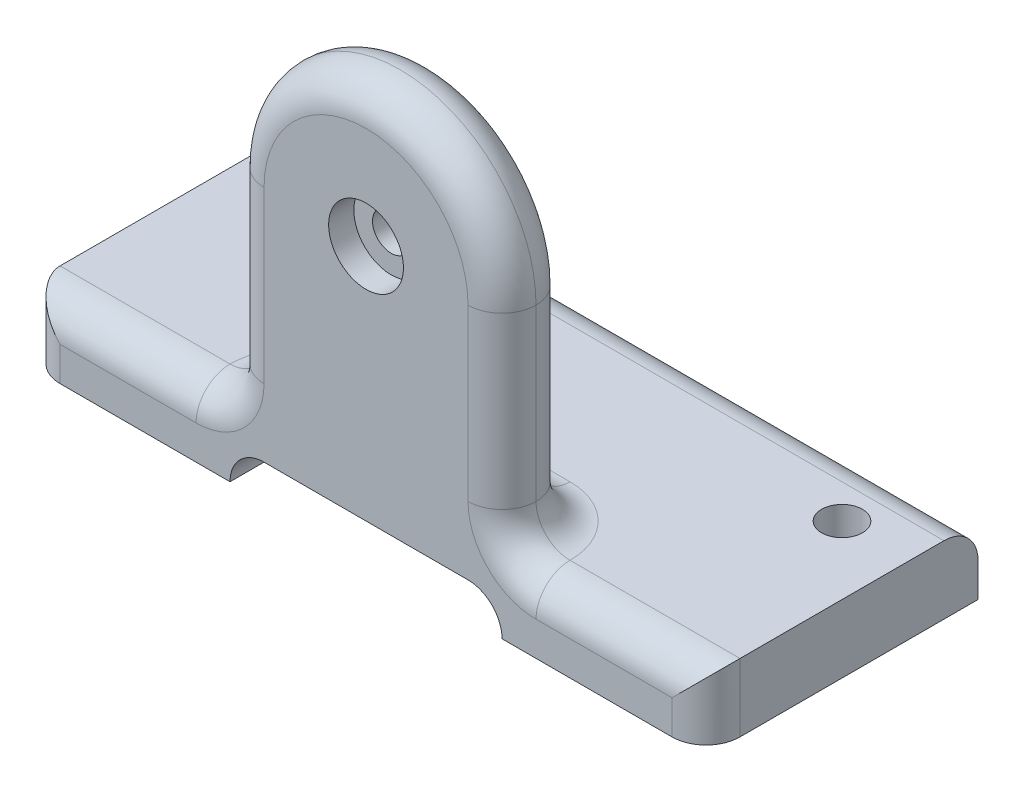
ISO-10303-21;
HEADER;
FILE_DESCRIPTION(('STEP AP214'),'2;1');
FILE_NAME('part.step','',(''),(''),'','','');
FILE_SCHEMA(('AUTOMOTIVE_DESIGN { 1 0 10303 214 1 1 1 1 }'));
ENDSEC;
DATA;
#1=APPLICATION_CONTEXT('core data for automotive mechanical design processes');
#2=APPLICATION_PROTOCOL_DEFINITION('international standard','automotive_design',2000,#1);
#3=PRODUCT_CONTEXT('',#1,'mechanical');
#4=PRODUCT('Part','Part','',(#3));
#5=PRODUCT_RELATED_PRODUCT_CATEGORY('part','',(#4));
#6=PRODUCT_DEFINITION_FORMATION('','',#4);
#7=PRODUCT_DEFINITION_CONTEXT('part definition',#1,'design');
#8=PRODUCT_DEFINITION('design','',#6,#7);
#9=PRODUCT_DEFINITION_SHAPE('','',#8);
#10=(LENGTH_UNIT() NAMED_UNIT(*) SI_UNIT(.MILLI.,.METRE.));
#11=(NAMED_UNIT(*) PLANE_ANGLE_UNIT() SI_UNIT($,.RADIAN.));
#12=(NAMED_UNIT(*) SI_UNIT($,.STERADIAN.) SOLID_ANGLE_UNIT());
#13=UNCERTAINTY_MEASURE_WITH_UNIT(LENGTH_MEASURE(1.E-05),#10,'distance_accuracy_value','');
#14=(GEOMETRIC_REPRESENTATION_CONTEXT(3) GLOBAL_UNCERTAINTY_ASSIGNED_CONTEXT((#13)) GLOBAL_UNIT_ASSIGNED_CONTEXT((#10,
#11,#12)) REPRESENTATION_CONTEXT('',''));
#15=CARTESIAN_POINT('',(0.,0.,0.));
#16=DIRECTION('',(0.,0.,1.));
#17=DIRECTION('',(1.,0.,0.));
#18=AXIS2_PLACEMENT_3D('',#15,#16,#17);
#19=CARTESIAN_POINT('',(-50.,10.,-20.));
#20=DIRECTION('',(0.,0.,1.));
#21=DIRECTION('',(1.,0.,0.));
#22=AXIS2_PLACEMENT_3D('',#19,#20,#21);
#23=PLANE('',#22);
#24=DIRECTION('',(0.,-1.,0.));
#25=VECTOR('',#24,1.);
#26=CARTESIAN_POINT('',(-50.,10.,-20.));
#27=LINE('',#26,#25);
#28=CARTESIAN_POINT('',(-50.,5.,-20.));
#29=VERTEX_POINT('',#28);
#30=CARTESIAN_POINT('',(-50.,0.,-20.));
#31=VERTEX_POINT('',#30);
#32=EDGE_CURVE('E192',#29,#31,#27,.T.);
#33=ORIENTED_EDGE('',*,*,#32,.F.);
#34=DIRECTION('',(-1.,0.,0.));
#35=VECTOR('',#34,1.);
#36=CARTESIAN_POINT('',(50.,5.,-20.));
#37=LINE('',#36,#35);
#38=CARTESIAN_POINT('',(-15.,5.,-20.));
#39=VERTEX_POINT('',#38);
#40=EDGE_CURVE('E11',#29,#39,#37,.F.);
#41=ORIENTED_EDGE('',*,*,#40,.T.);
#42=CARTESIAN_POINT('',(-15.,0.,-20.));
#43=DIRECTION('',(0.,0.,1.));
#44=DIRECTION('',(1.,0.,0.));
#45=AXIS2_PLACEMENT_3D('',#42,#43,#44);
#46=CIRCLE('',#45,5.);
#47=CARTESIAN_POINT('',(-20.,0.,-20.));
#48=VERTEX_POINT('',#47);
#49=EDGE_CURVE('E190',#39,#48,#46,.T.);
#50=ORIENTED_EDGE('',*,*,#49,.T.);
#51=DIRECTION('',(-1.,0.,0.));
#52=VECTOR('',#51,1.);
#53=CARTESIAN_POINT('',(-50.,0.,-20.));
#54=LINE('',#53,#52);
#55=EDGE_CURVE('E309',#48,#31,#54,.T.);
#56=ORIENTED_EDGE('',*,*,#55,.T.);
#57=EDGE_LOOP('',(#33,#41,#50,#56));
#58=FACE_BOUND('',#57,.T.);
#59=ADVANCED_FACE('F35',(#58),#23,.F.);
#60=CARTESIAN_POINT('',(0.,0.,0.));
#61=DIRECTION('',(0.,1.,0.));
#62=DIRECTION('',(0.,0.,1.));
#63=AXIS2_PLACEMENT_3D('',#60,#61,#62);
#64=PLANE('',#63);
#65=CARTESIAN_POINT('',(-40.,0.,-9.99999999999999));
#66=DIRECTION('',(0.,1.,0.));
#67=DIRECTION('',(0.,0.,1.));
#68=AXIS2_PLACEMENT_3D('',#65,#66,#67);
#69=CIRCLE('',#68,3.);
#70=CARTESIAN_POINT('',(-40.,0.,-6.99999999999999));
#71=VERTEX_POINT('',#70);
#72=EDGE_CURVE('E295',#71,#71,#69,.T.);
#73=ORIENTED_EDGE('',*,*,#72,.T.);
#74=EDGE_LOOP('',(#73));
#75=FACE_BOUND('',#74,.T.);
#76=DIRECTION('',(1.,0.,0.));
#77=VECTOR('',#76,1.);
#78=CARTESIAN_POINT('',(-50.,0.,20.));
#79=LINE('',#78,#77);
#80=CARTESIAN_POINT('',(-45.,0.,20.));
#81=VERTEX_POINT('',#80);
#82=CARTESIAN_POINT('',(-20.,0.,20.));
#83=VERTEX_POINT('',#82);
#84=EDGE_CURVE('E305',#81,#83,#79,.T.);
#85=ORIENTED_EDGE('',*,*,#84,.F.);
#86=CARTESIAN_POINT('',(-45.,0.,15.));
#87=DIRECTION('',(0.,1.,0.));
#88=DIRECTION('',(0.,0.,1.));
#89=AXIS2_PLACEMENT_3D('',#86,#87,#88);
#90=CIRCLE('',#89,5.);
#91=CARTESIAN_POINT('',(-50.,0.,15.));
#92=VERTEX_POINT('',#91);
#93=EDGE_CURVE('E206',#81,#92,#90,.F.);
#94=ORIENTED_EDGE('',*,*,#93,.T.);
#95=DIRECTION('',(0.,0.,1.));
#96=VECTOR('',#95,1.);
#97=CARTESIAN_POINT('',(-50.,0.,-20.));
#98=LINE('',#97,#96);
#99=EDGE_CURVE('E313',#31,#92,#98,.T.);
#100=ORIENTED_EDGE('',*,*,#99,.F.);
#101=ORIENTED_EDGE('',*,*,#55,.F.);
#102=DIRECTION('',(0.,0.,1.));
#103=VECTOR('',#102,1.);
#104=CARTESIAN_POINT('',(-20.,0.,-20.));
#105=LINE('',#104,#103);
#106=EDGE_CURVE('E211',#48,#83,#105,.T.);
#107=ORIENTED_EDGE('',*,*,#106,.T.);
#108=EDGE_LOOP('',(#85,#94,#100,#101,#107));
#109=FACE_BOUND('',#108,.T.);
#110=ADVANCED_FACE('F393',(#75,#109),#64,.F.);
#111=CARTESIAN_POINT('',(50.,10.,-20.));
#112=DIRECTION('',(-1.,0.,0.));
#113=DIRECTION('',(0.,0.,1.));
#114=AXIS2_PLACEMENT_3D('',#111,#112,#113);
#115=PLANE('',#114);
#116=DIRECTION('',(0.,-1.,0.));
#117=VECTOR('',#116,1.);
#118=CARTESIAN_POINT('',(50.,10.,-20.));
#119=LINE('',#118,#117);
#120=CARTESIAN_POINT('',(50.,5.,-20.));
#121=VERTEX_POINT('',#120);
#122=CARTESIAN_POINT('',(50.,0.,-20.));
#123=VERTEX_POINT('',#122);
#124=EDGE_CURVE('E319',#121,#123,#119,.T.);
#125=ORIENTED_EDGE('',*,*,#124,.F.);
#126=CARTESIAN_POINT('',(50.,5.,-15.));
#127=DIRECTION('',(-1.,0.,0.));
#128=DIRECTION('',(0.,0.,1.));
#129=AXIS2_PLACEMENT_3D('',#126,#127,#128);
#130=CIRCLE('',#129,5.);
#131=CARTESIAN_POINT('',(50.,10.,-15.));
#132=VERTEX_POINT('',#131);
#133=EDGE_CURVE('E371',#121,#132,#130,.F.);
#134=ORIENTED_EDGE('',*,*,#133,.T.);
#135=DIRECTION('',(0.,0.,-1.));
#136=VECTOR('',#135,1.);
#137=CARTESIAN_POINT('',(50.,10.,-20.));
#138=LINE('',#137,#136);
#139=CARTESIAN_POINT('',(50.,10.,15.));
#140=VERTEX_POINT('',#139);
#141=EDGE_CURVE('E301',#140,#132,#138,.T.);
#142=ORIENTED_EDGE('',*,*,#141,.F.);
#143=DIRECTION('',(0.,-1.,0.));
#144=VECTOR('',#143,1.);
#145=CARTESIAN_POINT('',(50.,10.,15.));
#146=LINE('',#145,#144);
#147=CARTESIAN_POINT('',(50.,0.,15.));
#148=VERTEX_POINT('',#147);
#149=EDGE_CURVE('E54',#140,#148,#146,.T.);
#150=ORIENTED_EDGE('',*,*,#149,.T.);
#151=DIRECTION('',(0.,0.,-1.));
#152=VECTOR('',#151,1.);
#153=CARTESIAN_POINT('',(50.,0.,-20.));
#154=LINE('',#153,#152);
#155=EDGE_CURVE('E298',#148,#123,#154,.T.);
#156=ORIENTED_EDGE('',*,*,#155,.T.);
#157=EDGE_LOOP('',(#125,#134,#142,#150,#156));
#158=FACE_BOUND('',#157,.T.);
#159=ADVANCED_FACE('F411',(#158),#115,.F.);
#160=CARTESIAN_POINT('',(15.,0.,-20.));
#161=DIRECTION('',(0.,0.,1.));
#162=DIRECTION('',(1.,0.,0.));
#163=AXIS2_PLACEMENT_3D('',#160,#161,#162);
#164=CIRCLE('',#163,5.);
#165=CARTESIAN_POINT('',(20.,0.,-20.));
#166=VERTEX_POINT('',#165);
#167=CARTESIAN_POINT('',(15.,5.,-20.));
#168=VERTEX_POINT('',#167);
#169=EDGE_CURVE('E216',#166,#168,#164,.T.);
#170=ORIENTED_EDGE('',*,*,#169,.T.);
#171=DIRECTION('',(-1.,0.,0.));
#172=VECTOR('',#171,1.);
#173=CARTESIAN_POINT('',(50.,5.,-20.));
#174=LINE('',#173,#172);
#175=EDGE_CURVE('E45',#168,#121,#174,.F.);
#176=ORIENTED_EDGE('',*,*,#175,.T.);
#177=ORIENTED_EDGE('',*,*,#124,.T.);
#178=EDGE_CURVE('E310',#123,#166,#54,.T.);
#179=ORIENTED_EDGE('',*,*,#178,.T.);
#180=EDGE_LOOP('',(#170,#176,#177,#179));
#181=FACE_BOUND('',#180,.T.);
#182=ADVANCED_FACE('F380',(#181),#23,.F.);
#183=CARTESIAN_POINT('',(-50.,10.,-20.));
#184=DIRECTION('',(1.,0.,0.));
#185=DIRECTION('',(0.,0.,-1.));
#186=AXIS2_PLACEMENT_3D('',#183,#184,#185);
#187=PLANE('',#186);
#188=DIRECTION('',(0.,0.,1.));
#189=VECTOR('',#188,1.);
#190=CARTESIAN_POINT('',(-50.,10.,-20.));
#191=LINE('',#190,#189);
#192=CARTESIAN_POINT('',(-50.,10.,-15.));
#193=VERTEX_POINT('',#192);
#194=CARTESIAN_POINT('',(-50.,10.,15.));
#195=VERTEX_POINT('',#194);
#196=EDGE_CURVE('E304',#193,#195,#191,.T.);
#197=ORIENTED_EDGE('',*,*,#196,.F.);
#198=CARTESIAN_POINT('',(-50.,5.,-15.));
#199=DIRECTION('',(1.,0.,0.));
#200=DIRECTION('',(0.,0.,-1.));
#201=AXIS2_PLACEMENT_3D('',#198,#199,#200);
#202=CIRCLE('',#201,5.);
#203=EDGE_CURVE('E368',#193,#29,#202,.F.);
#204=ORIENTED_EDGE('',*,*,#203,.T.);
#205=ORIENTED_EDGE('',*,*,#32,.T.);
#206=ORIENTED_EDGE('',*,*,#99,.T.);
#207=DIRECTION('',(0.,-1.,0.));
#208=VECTOR('',#207,1.);
#209=CARTESIAN_POINT('',(-50.,10.,15.));
#210=LINE('',#209,#208);
#211=EDGE_CURVE('E366',#92,#195,#210,.F.);
#212=ORIENTED_EDGE('',*,*,#211,.T.);
#213=EDGE_LOOP('',(#197,#204,#205,#206,#212));
#214=FACE_BOUND('',#213,.T.);
#215=ADVANCED_FACE('F398',(#214),#187,.F.);
#216=CARTESIAN_POINT('',(-50.,10.,20.));
#217=DIRECTION('',(0.,0.,-1.));
#218=DIRECTION('',(-1.,0.,0.));
#219=AXIS2_PLACEMENT_3D('',#216,#217,#218);
#220=PLANE('',#219);
#221=CARTESIAN_POINT('',(0.,40.,20.));
#222=DIRECTION('',(0.,0.,1.));
#223=DIRECTION('',(1.,0.,0.));
#224=AXIS2_PLACEMENT_3D('',#221,#222,#223);
#225=CIRCLE('',#224,5.5);
#226=CARTESIAN_POINT('',(5.50000000000002,40.,20.));
#227=VERTEX_POINT('',#226);
#228=EDGE_CURVE('E275',#227,#227,#225,.T.);
#229=ORIENTED_EDGE('',*,*,#228,.F.);
#230=EDGE_LOOP('',(#229));
#231=FACE_BOUND('',#230,.T.);
#232=CARTESIAN_POINT('',(20.,0.,20.));
#233=VERTEX_POINT('',#232);
#234=CARTESIAN_POINT('',(45.,0.,20.));
#235=VERTEX_POINT('',#234);
#236=EDGE_CURVE('E316',#233,#235,#79,.T.);
#237=ORIENTED_EDGE('',*,*,#236,.T.);
#238=DIRECTION('',(0.,-1.,0.));
#239=VECTOR('',#238,1.);
#240=CARTESIAN_POINT('',(45.,10.,20.));
#241=LINE('',#240,#239);
#242=CARTESIAN_POINT('',(45.,5.,20.));
#243=VERTEX_POINT('',#242);
#244=EDGE_CURVE('E355',#235,#243,#241,.F.);
#245=ORIENTED_EDGE('',*,*,#244,.T.);
#246=DIRECTION('',(1.,0.,0.));
#247=VECTOR('',#246,1.);
#248=CARTESIAN_POINT('',(20.,5.,20.));
#249=LINE('',#248,#247);
#250=CARTESIAN_POINT('',(25.,5.,20.));
#251=VERTEX_POINT('',#250);
#252=EDGE_CURVE('E353',#243,#251,#249,.F.);
#253=ORIENTED_EDGE('',*,*,#252,.T.);
#254=CARTESIAN_POINT('',(25.,15.,20.));
#255=DIRECTION('',(0.,0.,-1.));
#256=DIRECTION('',(-1.,0.,0.));
#257=AXIS2_PLACEMENT_3D('',#254,#255,#256);
#258=CIRCLE('',#257,10.);
#259=CARTESIAN_POINT('',(15.,15.,20.));
#260=VERTEX_POINT('',#259);
#261=EDGE_CURVE('E350',#260,#251,#258,.F.);
#262=ORIENTED_EDGE('',*,*,#261,.F.);
#263=DIRECTION('',(0.,1.,0.));
#264=VECTOR('',#263,1.);
#265=CARTESIAN_POINT('',(15.,40.,20.));
#266=LINE('',#265,#264);
#267=CARTESIAN_POINT('',(15.,40.,20.));
#268=VERTEX_POINT('',#267);
#269=EDGE_CURVE('E348',#260,#268,#266,.T.);
#270=ORIENTED_EDGE('',*,*,#269,.T.);
#271=CARTESIAN_POINT('',(0.,40.,20.));
#272=DIRECTION('',(0.,0.,-1.));
#273=DIRECTION('',(-1.,0.,0.));
#274=AXIS2_PLACEMENT_3D('',#271,#272,#273);
#275=CIRCLE('',#274,15.);
#276=CARTESIAN_POINT('',(-15.,40.,20.));
#277=VERTEX_POINT('',#276);
#278=EDGE_CURVE('E346',#268,#277,#275,.F.);
#279=ORIENTED_EDGE('',*,*,#278,.T.);
#280=DIRECTION('',(0.,-1.,0.));
#281=VECTOR('',#280,1.);
#282=CARTESIAN_POINT('',(-15.,10.,20.));
#283=LINE('',#282,#281);
#284=CARTESIAN_POINT('',(-15.,15.,20.));
#285=VERTEX_POINT('',#284);
#286=EDGE_CURVE('E344',#277,#285,#283,.T.);
#287=ORIENTED_EDGE('',*,*,#286,.T.);
#288=CARTESIAN_POINT('',(-25.,15.,20.));
#289=DIRECTION('',(0.,0.,-1.));
#290=DIRECTION('',(-1.,0.,0.));
#291=AXIS2_PLACEMENT_3D('',#288,#289,#290);
#292=CIRCLE('',#291,10.);
#293=CARTESIAN_POINT('',(-25.,5.,20.));
#294=VERTEX_POINT('',#293);
#295=EDGE_CURVE('E341',#294,#285,#292,.F.);
#296=ORIENTED_EDGE('',*,*,#295,.F.);
#297=DIRECTION('',(1.,0.,0.));
#298=VECTOR('',#297,1.);
#299=CARTESIAN_POINT('',(-50.,5.,20.));
#300=LINE('',#299,#298);
#301=CARTESIAN_POINT('',(-45.,5.,20.));
#302=VERTEX_POINT('',#301);
#303=EDGE_CURVE('E339',#294,#302,#300,.F.);
#304=ORIENTED_EDGE('',*,*,#303,.T.);
#305=DIRECTION('',(0.,-1.,0.));
#306=VECTOR('',#305,1.);
#307=CARTESIAN_POINT('',(-45.,10.,20.));
#308=LINE('',#307,#306);
#309=EDGE_CURVE('E337',#302,#81,#308,.T.);
#310=ORIENTED_EDGE('',*,*,#309,.T.);
#311=ORIENTED_EDGE('',*,*,#84,.T.);
#312=CARTESIAN_POINT('',(-15.,0.,20.));
#313=DIRECTION('',(0.,0.,-1.));
#314=DIRECTION('',(-1.,0.,0.));
#315=AXIS2_PLACEMENT_3D('',#312,#313,#314);
#316=CIRCLE('',#315,5.);
#317=CARTESIAN_POINT('',(-15.,5.,20.));
#318=VERTEX_POINT('',#317);
#319=EDGE_CURVE('E89',#83,#318,#316,.T.);
#320=ORIENTED_EDGE('',*,*,#319,.T.);
#321=DIRECTION('',(-1.,0.,0.));
#322=VECTOR('',#321,1.);
#323=CARTESIAN_POINT('',(-20.,5.,20.));
#324=LINE('',#323,#322);
#325=CARTESIAN_POINT('',(15.,5.,20.));
#326=VERTEX_POINT('',#325);
#327=EDGE_CURVE('E204',#326,#318,#324,.T.);
#328=ORIENTED_EDGE('',*,*,#327,.F.);
#329=CARTESIAN_POINT('',(15.,0.,20.));
#330=DIRECTION('',(0.,0.,-1.));
#331=DIRECTION('',(-1.,0.,0.));
#332=AXIS2_PLACEMENT_3D('',#329,#330,#331);
#333=CIRCLE('',#332,5.);
#334=EDGE_CURVE('E377',#326,#233,#333,.T.);
#335=ORIENTED_EDGE('',*,*,#334,.T.);
#336=EDGE_LOOP('',(#237,#245,#253,#262,#270,#279,#287,#296,#304,#310,#311,#320,#328,#335));
#337=FACE_BOUND('',#336,.T.);
#338=ADVANCED_FACE('F387',(#231,#337),#220,.F.);
#339=CARTESIAN_POINT('',(0.,10.,0.));
#340=DIRECTION('',(0.,1.,0.));
#341=DIRECTION('',(0.,0.,1.));
#342=AXIS2_PLACEMENT_3D('',#339,#340,#341);
#343=PLANE('',#342);
#344=CARTESIAN_POINT('',(40.,10.,-9.99999999999999));
#345=DIRECTION('',(0.,1.,0.));
#346=DIRECTION('',(0.,0.,1.));
#347=AXIS2_PLACEMENT_3D('',#344,#345,#346);
#348=CIRCLE('',#347,3.);
#349=CARTESIAN_POINT('',(40.,10.,-6.99999999999999));
#350=VERTEX_POINT('',#349);
#351=EDGE_CURVE('E288',#350,#350,#348,.T.);
#352=ORIENTED_EDGE('',*,*,#351,.F.);
#353=EDGE_LOOP('',(#352));
#354=FACE_BOUND('',#353,.T.);
#355=CARTESIAN_POINT('',(-40.,10.,-9.99999999999999));
#356=DIRECTION('',(0.,1.,0.));
#357=DIRECTION('',(0.,0.,1.));
#358=AXIS2_PLACEMENT_3D('',#355,#356,#357);
#359=CIRCLE('',#358,3.);
#360=CARTESIAN_POINT('',(-40.,10.,-6.99999999999999));
#361=VERTEX_POINT('',#360);
#362=EDGE_CURVE('E292',#361,#361,#359,.T.);
#363=ORIENTED_EDGE('',*,*,#362,.F.);
#364=EDGE_LOOP('',(#363));
#365=FACE_BOUND('',#364,.T.);
#366=ORIENTED_EDGE('',*,*,#196,.T.);
#367=DIRECTION('',(1.,0.,0.));
#368=VECTOR('',#367,1.);
#369=CARTESIAN_POINT('',(-20.,10.,15.));
#370=LINE('',#369,#368);
#371=CARTESIAN_POINT('',(-25.,10.,15.));
#372=VERTEX_POINT('',#371);
#373=EDGE_CURVE('E334',#195,#372,#370,.T.);
#374=ORIENTED_EDGE('',*,*,#373,.T.);
#375=CARTESIAN_POINT('',(-15.,10.,15.));
#376=DIRECTION('',(0.,1.,0.));
#377=DIRECTION('',(0.,0.,1.));
#378=AXIS2_PLACEMENT_3D('',#375,#376,#377);
#379=CIRCLE('',#378,10.);
#380=CARTESIAN_POINT('',(-15.,10.,5.00000000000001));
#381=VERTEX_POINT('',#380);
#382=EDGE_CURVE('E331',#381,#372,#379,.T.);
#383=ORIENTED_EDGE('',*,*,#382,.F.);
#384=DIRECTION('',(-1.,0.,0.));
#385=VECTOR('',#384,1.);
#386=CARTESIAN_POINT('',(20.,10.,5.00000000000001));
#387=LINE('',#386,#385);
#388=CARTESIAN_POINT('',(15.,10.,5.00000000000001));
#389=VERTEX_POINT('',#388);
#390=EDGE_CURVE('E329',#381,#389,#387,.F.);
#391=ORIENTED_EDGE('',*,*,#390,.T.);
#392=CARTESIAN_POINT('',(15.,10.,15.));
#393=DIRECTION('',(0.,1.,0.));
#394=DIRECTION('',(0.,0.,1.));
#395=AXIS2_PLACEMENT_3D('',#392,#393,#394);
#396=CIRCLE('',#395,10.);
#397=CARTESIAN_POINT('',(25.,10.,15.));
#398=VERTEX_POINT('',#397);
#399=EDGE_CURVE('E327',#398,#389,#396,.T.);
#400=ORIENTED_EDGE('',*,*,#399,.F.);
#401=DIRECTION('',(1.,0.,0.));
#402=VECTOR('',#401,1.);
#403=CARTESIAN_POINT('',(50.,10.,15.));
#404=LINE('',#403,#402);
#405=EDGE_CURVE('E325',#398,#140,#404,.T.);
#406=ORIENTED_EDGE('',*,*,#405,.T.);
#407=ORIENTED_EDGE('',*,*,#141,.T.);
#408=DIRECTION('',(-1.,0.,0.));
#409=VECTOR('',#408,1.);
#410=CARTESIAN_POINT('',(-50.,10.,-15.));
#411=LINE('',#410,#409);
#412=EDGE_CURVE('E322',#132,#193,#411,.T.);
#413=ORIENTED_EDGE('',*,*,#412,.T.);
#414=EDGE_LOOP('',(#366,#374,#383,#391,#400,#406,#407,#413));
#415=FACE_BOUND('',#414,.T.);
#416=ADVANCED_FACE('F408',(#354,#365,#415),#343,.T.);
#417=CARTESIAN_POINT('',(40.,0.,-9.99999999999999));
#418=DIRECTION('',(0.,1.,0.));
#419=DIRECTION('',(0.,0.,1.));
#420=AXIS2_PLACEMENT_3D('',#417,#418,#419);
#421=CIRCLE('',#420,3.);
#422=CARTESIAN_POINT('',(40.,0.,-6.99999999999999));
#423=VERTEX_POINT('',#422);
#424=EDGE_CURVE('E289',#423,#423,#421,.T.);
#425=ORIENTED_EDGE('',*,*,#424,.T.);
#426=EDGE_LOOP('',(#425));
#427=FACE_BOUND('',#426,.T.);
#428=ORIENTED_EDGE('',*,*,#155,.F.);
#429=CARTESIAN_POINT('',(45.,0.,15.));
#430=DIRECTION('',(0.,1.,0.));
#431=DIRECTION('',(0.,0.,1.));
#432=AXIS2_PLACEMENT_3D('',#429,#430,#431);
#433=CIRCLE('',#432,5.);
#434=EDGE_CURVE('E373',#148,#235,#433,.F.);
#435=ORIENTED_EDGE('',*,*,#434,.T.);
#436=ORIENTED_EDGE('',*,*,#236,.F.);
#437=DIRECTION('',(0.,0.,1.));
#438=VECTOR('',#437,1.);
#439=CARTESIAN_POINT('',(20.,0.,-20.));
#440=LINE('',#439,#438);
#441=EDGE_CURVE('E272',#166,#233,#440,.T.);
#442=ORIENTED_EDGE('',*,*,#441,.F.);
#443=ORIENTED_EDGE('',*,*,#178,.F.);
#444=EDGE_LOOP('',(#428,#435,#436,#442,#443));
#445=FACE_BOUND('',#444,.T.);
#446=ADVANCED_FACE('F424',(#427,#445),#64,.F.);
#447=CARTESIAN_POINT('',(0.,40.,10.));
#448=DIRECTION('',(0.,0.,-1.));
#449=DIRECTION('',(-1.,0.,0.));
#450=AXIS2_PLACEMENT_3D('',#447,#448,#449);
#451=PLANE('',#450);
#452=DIRECTION('',(0.,1.,0.));
#453=VECTOR('',#452,1.);
#454=CARTESIAN_POINT('',(15.,40.,10.));
#455=LINE('',#454,#453);
#456=CARTESIAN_POINT('',(15.,40.,10.));
#457=VERTEX_POINT('',#456);
#458=CARTESIAN_POINT('',(15.,15.,10.));
#459=VERTEX_POINT('',#458);
#460=EDGE_CURVE('E357',#457,#459,#455,.F.);
#461=ORIENTED_EDGE('',*,*,#460,.T.);
#462=DIRECTION('',(-1.,0.,0.));
#463=VECTOR('',#462,1.);
#464=CARTESIAN_POINT('',(-20.,15.,10.));
#465=LINE('',#464,#463);
#466=CARTESIAN_POINT('',(-15.,15.,10.));
#467=VERTEX_POINT('',#466);
#468=EDGE_CURVE('E363',#459,#467,#465,.T.);
#469=ORIENTED_EDGE('',*,*,#468,.T.);
#470=DIRECTION('',(0.,-1.,0.));
#471=VECTOR('',#470,1.);
#472=CARTESIAN_POINT('',(-15.,40.,10.));
#473=LINE('',#472,#471);
#474=CARTESIAN_POINT('',(-15.,40.,10.));
#475=VERTEX_POINT('',#474);
#476=EDGE_CURVE('E361',#467,#475,#473,.F.);
#477=ORIENTED_EDGE('',*,*,#476,.T.);
#478=CARTESIAN_POINT('',(0.,40.,10.));
#479=DIRECTION('',(0.,0.,-1.));
#480=DIRECTION('',(-1.,0.,0.));
#481=AXIS2_PLACEMENT_3D('',#478,#479,#480);
#482=CIRCLE('',#481,15.);
#483=EDGE_CURVE('E359',#475,#457,#482,.T.);
#484=ORIENTED_EDGE('',*,*,#483,.T.);
#485=EDGE_LOOP('',(#461,#469,#477,#484));
#486=FACE_BOUND('',#485,.T.);
#487=CARTESIAN_POINT('',(0.,40.,10.));
#488=DIRECTION('',(0.,0.,-1.));
#489=DIRECTION('',(-1.,0.,0.));
#490=AXIS2_PLACEMENT_3D('',#487,#488,#489);
#491=CIRCLE('',#490,2.75);
#492=CARTESIAN_POINT('',(-2.74999999999997,40.,10.));
#493=VERTEX_POINT('',#492);
#494=EDGE_CURVE('E285',#493,#493,#491,.T.);
#495=ORIENTED_EDGE('',*,*,#494,.F.);
#496=EDGE_LOOP('',(#495));
#497=FACE_BOUND('',#496,.T.);
#498=ADVANCED_FACE('F426',(#486,#497),#451,.T.);
#499=CARTESIAN_POINT('',(-40.,0.,-9.99999999999999));
#500=DIRECTION('',(0.,1.,0.));
#501=DIRECTION('',(0.,0.,1.));
#502=AXIS2_PLACEMENT_3D('',#499,#500,#501);
#503=CYLINDRICAL_SURFACE('',#502,3.);
#504=ORIENTED_EDGE('',*,*,#72,.F.);
#505=EDGE_LOOP('',(#504));
#506=FACE_BOUND('',#505,.T.);
#507=ORIENTED_EDGE('',*,*,#362,.T.);
#508=EDGE_LOOP('',(#507));
#509=FACE_BOUND('',#508,.T.);
#510=ADVANCED_FACE('F433',(#506,#509),#503,.F.);
#511=CARTESIAN_POINT('',(40.,0.,-9.99999999999999));
#512=DIRECTION('',(0.,1.,0.));
#513=DIRECTION('',(0.,0.,1.));
#514=AXIS2_PLACEMENT_3D('',#511,#512,#513);
#515=CYLINDRICAL_SURFACE('',#514,3.);
#516=ORIENTED_EDGE('',*,*,#424,.F.);
#517=EDGE_LOOP('',(#516));
#518=FACE_BOUND('',#517,.T.);
#519=ORIENTED_EDGE('',*,*,#351,.T.);
#520=EDGE_LOOP('',(#519));
#521=FACE_BOUND('',#520,.T.);
#522=ADVANCED_FACE('F648',(#518,#521),#515,.F.);
#523=CARTESIAN_POINT('',(0.,40.,20.));
#524=DIRECTION('',(0.,0.,1.));
#525=DIRECTION('',(1.,0.,0.));
#526=AXIS2_PLACEMENT_3D('',#523,#524,#525);
#527=CYLINDRICAL_SURFACE('',#526,2.75);
#528=CARTESIAN_POINT('',(0.,40.,16.3));
#529=DIRECTION('',(0.,0.,1.));
#530=DIRECTION('',(1.,0.,0.));
#531=AXIS2_PLACEMENT_3D('',#528,#529,#530);
#532=CIRCLE('',#531,2.75);
#533=CARTESIAN_POINT('',(2.75000000000002,40.,16.3));
#534=VERTEX_POINT('',#533);
#535=EDGE_CURVE('E282',#534,#534,#532,.T.);
#536=ORIENTED_EDGE('',*,*,#535,.T.);
#537=EDGE_LOOP('',(#536));
#538=FACE_BOUND('',#537,.T.);
#539=ORIENTED_EDGE('',*,*,#494,.T.);
#540=EDGE_LOOP('',(#539));
#541=FACE_BOUND('',#540,.T.);
#542=ADVANCED_FACE('F655',(#538,#541),#527,.F.);
#543=CARTESIAN_POINT('',(2.75000000000002,40.,16.3));
#544=DIRECTION('',(0.,0.,-1.));
#545=DIRECTION('',(-1.,0.,0.));
#546=AXIS2_PLACEMENT_3D('',#543,#544,#545);
#547=PLANE('',#546);
#548=ORIENTED_EDGE('',*,*,#535,.F.);
#549=EDGE_LOOP('',(#548));
#550=FACE_BOUND('',#549,.T.);
#551=CARTESIAN_POINT('',(0.,40.,16.3));
#552=DIRECTION('',(0.,0.,1.));
#553=DIRECTION('',(1.,0.,0.));
#554=AXIS2_PLACEMENT_3D('',#551,#552,#553);
#555=CIRCLE('',#554,5.5);
#556=CARTESIAN_POINT('',(5.50000000000002,40.,16.3));
#557=VERTEX_POINT('',#556);
#558=EDGE_CURVE('E279',#557,#557,#555,.T.);
#559=ORIENTED_EDGE('',*,*,#558,.T.);
#560=EDGE_LOOP('',(#559));
#561=FACE_BOUND('',#560,.T.);
#562=ADVANCED_FACE('F663',(#550,#561),#547,.F.);
#563=CARTESIAN_POINT('',(0.,40.,20.));
#564=DIRECTION('',(0.,0.,1.));
#565=DIRECTION('',(1.,0.,0.));
#566=AXIS2_PLACEMENT_3D('',#563,#564,#565);
#567=CYLINDRICAL_SURFACE('',#566,5.5);
#568=ORIENTED_EDGE('',*,*,#558,.F.);
#569=EDGE_LOOP('',(#568));
#570=FACE_BOUND('',#569,.T.);
#571=ORIENTED_EDGE('',*,*,#228,.T.);
#572=EDGE_LOOP('',(#571));
#573=FACE_BOUND('',#572,.T.);
#574=ADVANCED_FACE('F626',(#570,#573),#567,.F.);
#575=CARTESIAN_POINT('',(-20.,5.,-20.));
#576=DIRECTION('',(0.,1.,0.));
#577=DIRECTION('',(0.,0.,1.));
#578=AXIS2_PLACEMENT_3D('',#575,#576,#577);
#579=PLANE('',#578);
#580=DIRECTION('',(-1.,0.,0.));
#581=VECTOR('',#580,1.);
#582=CARTESIAN_POINT('',(-20.,5.,-20.));
#583=LINE('',#582,#581);
#584=EDGE_CURVE('E201',#168,#39,#583,.T.);
#585=ORIENTED_EDGE('',*,*,#584,.F.);
#586=DIRECTION('',(0.,0.,1.));
#587=VECTOR('',#586,1.);
#588=CARTESIAN_POINT('',(15.,5.,20.));
#589=LINE('',#588,#587);
#590=EDGE_CURVE('E205',#168,#326,#589,.T.);
#591=ORIENTED_EDGE('',*,*,#590,.T.);
#592=ORIENTED_EDGE('',*,*,#327,.T.);
#593=DIRECTION('',(0.,0.,1.));
#594=VECTOR('',#593,1.);
#595=CARTESIAN_POINT('',(-15.,5.,-20.));
#596=LINE('',#595,#594);
#597=EDGE_CURVE('E198',#318,#39,#596,.F.);
#598=ORIENTED_EDGE('',*,*,#597,.T.);
#599=EDGE_LOOP('',(#585,#591,#592,#598));
#600=FACE_BOUND('',#599,.T.);
#601=ADVANCED_FACE('F199',(#600),#579,.F.);
#602=CARTESIAN_POINT('',(45.,10.,15.));
#603=DIRECTION('',(0.,-1.,0.));
#604=DIRECTION('',(0.,0.,-1.));
#605=AXIS2_PLACEMENT_3D('',#602,#603,#604);
#606=CYLINDRICAL_SURFACE('',#605,5.);
#607=ORIENTED_EDGE('',*,*,#434,.F.);
#608=ORIENTED_EDGE('',*,*,#149,.F.);
#609=CARTESIAN_POINT('',(45.,5.,15.));
#610=DIRECTION('',(0.707106781186547,-0.707106781186547,0.));
#611=DIRECTION('',(-0.707106781186547,-0.707106781186547,0.));
#612=AXIS2_PLACEMENT_3D('',#609,#610,#611);
#613=ELLIPSE('',#612,7.07106781186547,5.);
#614=EDGE_CURVE('E39',#243,#140,#613,.F.);
#615=ORIENTED_EDGE('',*,*,#614,.F.);
#616=ORIENTED_EDGE('',*,*,#244,.F.);
#617=EDGE_LOOP('',(#607,#608,#615,#616));
#618=FACE_BOUND('',#617,.T.);
#619=ADVANCED_FACE('F422',(#618),#606,.T.);
#620=CARTESIAN_POINT('',(0.,5.,15.));
#621=DIRECTION('',(-1.,0.,0.));
#622=DIRECTION('',(0.,0.,1.));
#623=AXIS2_PLACEMENT_3D('',#620,#621,#622);
#624=CYLINDRICAL_SURFACE('',#623,5.);
#625=ORIENTED_EDGE('',*,*,#614,.T.);
#626=ORIENTED_EDGE('',*,*,#405,.F.);
#627=CARTESIAN_POINT('',(25.,5.,15.));
#628=DIRECTION('',(-1.,0.,0.));
#629=DIRECTION('',(0.,0.,1.));
#630=AXIS2_PLACEMENT_3D('',#627,#628,#629);
#631=CIRCLE('',#630,5.);
#632=EDGE_CURVE('E260',#251,#398,#631,.T.);
#633=ORIENTED_EDGE('',*,*,#632,.F.);
#634=ORIENTED_EDGE('',*,*,#252,.F.);
#635=EDGE_LOOP('',(#625,#626,#633,#634));
#636=FACE_BOUND('',#635,.T.);
#637=ADVANCED_FACE('F413',(#636),#624,.T.);
#638=CARTESIAN_POINT('',(15.,15.,15.));
#639=DIRECTION('',(0.,1.,0.));
#640=DIRECTION('',(0.,0.,1.));
#641=AXIS2_PLACEMENT_3D('',#638,#639,#640);
#642=TOROIDAL_SURFACE('',#641,10.,5.);
#643=CARTESIAN_POINT('',(15.,15.,5.00000000000001));
#644=DIRECTION('',(-1.,0.,0.));
#645=DIRECTION('',(0.,0.,1.));
#646=AXIS2_PLACEMENT_3D('',#643,#644,#645);
#647=CIRCLE('',#646,5.);
#648=EDGE_CURVE('E257',#459,#389,#647,.F.);
#649=ORIENTED_EDGE('',*,*,#648,.F.);
#650=CARTESIAN_POINT('',(15.,15.,15.));
#651=DIRECTION('',(0.,1.,0.));
#652=DIRECTION('',(0.,0.,1.));
#653=AXIS2_PLACEMENT_3D('',#650,#651,#652);
#654=CIRCLE('',#653,5.);
#655=CARTESIAN_POINT('',(20.,15.,15.));
#656=VERTEX_POINT('',#655);
#657=EDGE_CURVE('E80',#656,#459,#654,.T.);
#658=ORIENTED_EDGE('',*,*,#657,.F.);
#659=CARTESIAN_POINT('',(25.,15.,15.));
#660=DIRECTION('',(0.,0.,1.));
#661=DIRECTION('',(1.,0.,0.));
#662=AXIS2_PLACEMENT_3D('',#659,#660,#661);
#663=CIRCLE('',#662,5.);
#664=EDGE_CURVE('E263',#656,#398,#663,.T.);
#665=ORIENTED_EDGE('',*,*,#664,.T.);
#666=ORIENTED_EDGE('',*,*,#399,.T.);
#667=EDGE_LOOP('',(#649,#658,#665,#666));
#668=FACE_BOUND('',#667,.T.);
#669=ADVANCED_FACE('F497',(#668),#642,.F.);
#670=CARTESIAN_POINT('',(15.,40.,15.));
#671=DIRECTION('',(0.,1.,0.));
#672=DIRECTION('',(-1.,0.,0.));
#673=AXIS2_PLACEMENT_3D('',#670,#671,#672);
#674=CYLINDRICAL_SURFACE('',#673,5.);
#675=ORIENTED_EDGE('',*,*,#657,.T.);
#676=ORIENTED_EDGE('',*,*,#460,.F.);
#677=CARTESIAN_POINT('',(15.,40.,15.));
#678=DIRECTION('',(0.,1.,0.));
#679=DIRECTION('',(0.,0.,1.));
#680=AXIS2_PLACEMENT_3D('',#677,#678,#679);
#681=CIRCLE('',#680,5.);
#682=CARTESIAN_POINT('',(20.,40.,15.));
#683=VERTEX_POINT('',#682);
#684=EDGE_CURVE('E72',#683,#457,#681,.T.);
#685=ORIENTED_EDGE('',*,*,#684,.F.);
#686=DIRECTION('',(0.,1.,0.));
#687=VECTOR('',#686,1.);
#688=CARTESIAN_POINT('',(20.,40.,15.));
#689=LINE('',#688,#687);
#690=EDGE_CURVE('E254',#656,#683,#689,.T.);
#691=ORIENTED_EDGE('',*,*,#690,.F.);
#692=EDGE_LOOP('',(#675,#676,#685,#691));
#693=FACE_BOUND('',#692,.T.);
#694=ADVANCED_FACE('F494',(#693),#674,.T.);
#695=CARTESIAN_POINT('',(25.,15.,15.));
#696=DIRECTION('',(0.,0.,-1.));
#697=DIRECTION('',(-1.,0.,0.));
#698=AXIS2_PLACEMENT_3D('',#695,#696,#697);
#699=TOROIDAL_SURFACE('',#698,10.,5.);
#700=ORIENTED_EDGE('',*,*,#632,.T.);
#701=ORIENTED_EDGE('',*,*,#664,.F.);
#702=CARTESIAN_POINT('',(15.,15.,15.));
#703=DIRECTION('',(0.,-1.,0.));
#704=DIRECTION('',(0.,0.,-1.));
#705=AXIS2_PLACEMENT_3D('',#702,#703,#704);
#706=CIRCLE('',#705,5.);
#707=EDGE_CURVE('E251',#260,#656,#706,.F.);
#708=ORIENTED_EDGE('',*,*,#707,.F.);
#709=ORIENTED_EDGE('',*,*,#261,.T.);
#710=EDGE_LOOP('',(#700,#701,#708,#709));
#711=FACE_BOUND('',#710,.T.);
#712=ADVANCED_FACE('F415',(#711),#699,.T.);
#713=CARTESIAN_POINT('',(0.,15.,5.00000000000001));
#714=DIRECTION('',(1.,0.,0.));
#715=DIRECTION('',(0.,0.,-1.));
#716=AXIS2_PLACEMENT_3D('',#713,#714,#715);
#717=CYLINDRICAL_SURFACE('',#716,5.);
#718=ORIENTED_EDGE('',*,*,#648,.T.);
#719=ORIENTED_EDGE('',*,*,#390,.F.);
#720=CARTESIAN_POINT('',(-15.,15.,5.00000000000001));
#721=DIRECTION('',(1.,0.,0.));
#722=DIRECTION('',(0.,0.,-1.));
#723=AXIS2_PLACEMENT_3D('',#720,#721,#722);
#724=CIRCLE('',#723,5.);
#725=EDGE_CURVE('E248',#467,#381,#724,.T.);
#726=ORIENTED_EDGE('',*,*,#725,.F.);
#727=ORIENTED_EDGE('',*,*,#468,.F.);
#728=EDGE_LOOP('',(#718,#719,#726,#727));
#729=FACE_BOUND('',#728,.T.);
#730=ADVANCED_FACE('F487',(#729),#717,.F.);
#731=CARTESIAN_POINT('',(0.,40.,15.));
#732=DIRECTION('',(0.,0.,-1.));
#733=DIRECTION('',(-1.,0.,0.));
#734=AXIS2_PLACEMENT_3D('',#731,#732,#733);
#735=TOROIDAL_SURFACE('',#734,15.,5.);
#736=ORIENTED_EDGE('',*,*,#684,.T.);
#737=ORIENTED_EDGE('',*,*,#483,.F.);
#738=CARTESIAN_POINT('',(-15.,40.,15.));
#739=DIRECTION('',(0.,-1.,0.));
#740=DIRECTION('',(0.,0.,-1.));
#741=AXIS2_PLACEMENT_3D('',#738,#739,#740);
#742=CIRCLE('',#741,5.);
#743=CARTESIAN_POINT('',(-20.,40.,15.));
#744=VERTEX_POINT('',#743);
#745=EDGE_CURVE('E243',#744,#475,#742,.T.);
#746=ORIENTED_EDGE('',*,*,#745,.F.);
#747=CARTESIAN_POINT('',(0.,40.,15.));
#748=DIRECTION('',(0.,0.,-1.));
#749=DIRECTION('',(-1.,0.,0.));
#750=AXIS2_PLACEMENT_3D('',#747,#748,#749);
#751=CIRCLE('',#750,20.);
#752=EDGE_CURVE('E240',#683,#744,#751,.F.);
#753=ORIENTED_EDGE('',*,*,#752,.F.);
#754=EDGE_LOOP('',(#736,#737,#746,#753));
#755=FACE_BOUND('',#754,.T.);
#756=ADVANCED_FACE('F483',(#755),#735,.T.);
#757=CARTESIAN_POINT('',(15.,10.,15.));
#758=DIRECTION('',(0.,-1.,0.));
#759=DIRECTION('',(1.,0.,0.));
#760=AXIS2_PLACEMENT_3D('',#757,#758,#759);
#761=CYLINDRICAL_SURFACE('',#760,5.);
#762=ORIENTED_EDGE('',*,*,#707,.T.);
#763=ORIENTED_EDGE('',*,*,#690,.T.);
#764=CARTESIAN_POINT('',(15.,40.,15.));
#765=DIRECTION('',(0.,1.,0.));
#766=DIRECTION('',(0.,0.,1.));
#767=AXIS2_PLACEMENT_3D('',#764,#765,#766);
#768=CIRCLE('',#767,5.);
#769=EDGE_CURVE('E237',#268,#683,#768,.T.);
#770=ORIENTED_EDGE('',*,*,#769,.F.);
#771=ORIENTED_EDGE('',*,*,#269,.F.);
#772=EDGE_LOOP('',(#762,#763,#770,#771));
#773=FACE_BOUND('',#772,.T.);
#774=ADVANCED_FACE('F479',(#773),#761,.T.);
#775=CARTESIAN_POINT('',(-15.,15.,15.));
#776=DIRECTION('',(0.,1.,0.));
#777=DIRECTION('',(0.,0.,1.));
#778=AXIS2_PLACEMENT_3D('',#775,#776,#777);
#779=TOROIDAL_SURFACE('',#778,10.,5.);
#780=CARTESIAN_POINT('',(-15.,15.,15.));
#781=DIRECTION('',(0.,1.,0.));
#782=DIRECTION('',(0.,0.,1.));
#783=AXIS2_PLACEMENT_3D('',#780,#781,#782);
#784=CIRCLE('',#783,5.);
#785=CARTESIAN_POINT('',(-20.,15.,15.));
#786=VERTEX_POINT('',#785);
#787=EDGE_CURVE('E246',#467,#786,#784,.T.);
#788=ORIENTED_EDGE('',*,*,#787,.F.);
#789=ORIENTED_EDGE('',*,*,#725,.T.);
#790=ORIENTED_EDGE('',*,*,#382,.T.);
#791=CARTESIAN_POINT('',(-25.,15.,15.));
#792=DIRECTION('',(0.,0.,1.));
#793=DIRECTION('',(1.,0.,0.));
#794=AXIS2_PLACEMENT_3D('',#791,#792,#793);
#795=CIRCLE('',#794,5.);
#796=EDGE_CURVE('E234',#786,#372,#795,.F.);
#797=ORIENTED_EDGE('',*,*,#796,.F.);
#798=EDGE_LOOP('',(#788,#789,#790,#797));
#799=FACE_BOUND('',#798,.T.);
#800=ADVANCED_FACE('F475',(#799),#779,.F.);
#801=CARTESIAN_POINT('',(-15.,0.,15.));
#802=DIRECTION('',(0.,-1.,0.));
#803=DIRECTION('',(0.,0.,-1.));
#804=AXIS2_PLACEMENT_3D('',#801,#802,#803);
#805=CYLINDRICAL_SURFACE('',#804,5.);
#806=ORIENTED_EDGE('',*,*,#476,.F.);
#807=ORIENTED_EDGE('',*,*,#787,.T.);
#808=DIRECTION('',(0.,-1.,0.));
#809=VECTOR('',#808,1.);
#810=CARTESIAN_POINT('',(-20.,0.,15.));
#811=LINE('',#810,#809);
#812=EDGE_CURVE('E231',#744,#786,#811,.T.);
#813=ORIENTED_EDGE('',*,*,#812,.F.);
#814=ORIENTED_EDGE('',*,*,#745,.T.);
#815=EDGE_LOOP('',(#806,#807,#813,#814));
#816=FACE_BOUND('',#815,.T.);
#817=ADVANCED_FACE('F471',(#816),#805,.T.);
#818=CARTESIAN_POINT('',(0.,40.,15.));
#819=DIRECTION('',(0.,0.,-1.));
#820=DIRECTION('',(-1.,0.,0.));
#821=AXIS2_PLACEMENT_3D('',#818,#819,#820);
#822=TOROIDAL_SURFACE('',#821,15.,5.);
#823=ORIENTED_EDGE('',*,*,#769,.T.);
#824=ORIENTED_EDGE('',*,*,#752,.T.);
#825=CARTESIAN_POINT('',(-15.,40.,15.));
#826=DIRECTION('',(0.,-1.,0.));
#827=DIRECTION('',(0.,0.,-1.));
#828=AXIS2_PLACEMENT_3D('',#825,#826,#827);
#829=CIRCLE('',#828,5.);
#830=EDGE_CURVE('E228',#277,#744,#829,.T.);
#831=ORIENTED_EDGE('',*,*,#830,.F.);
#832=ORIENTED_EDGE('',*,*,#278,.F.);
#833=EDGE_LOOP('',(#823,#824,#831,#832));
#834=FACE_BOUND('',#833,.T.);
#835=ADVANCED_FACE('F467',(#834),#822,.T.);
#836=CARTESIAN_POINT('',(-15.,10.,15.));
#837=DIRECTION('',(0.,1.,0.));
#838=DIRECTION('',(0.,0.,1.));
#839=AXIS2_PLACEMENT_3D('',#836,#837,#838);
#840=CYLINDRICAL_SURFACE('',#839,5.);
#841=ORIENTED_EDGE('',*,*,#830,.T.);
#842=ORIENTED_EDGE('',*,*,#812,.T.);
#843=CARTESIAN_POINT('',(-15.,15.,15.));
#844=DIRECTION('',(0.,-1.,0.));
#845=DIRECTION('',(0.,0.,-1.));
#846=AXIS2_PLACEMENT_3D('',#843,#844,#845);
#847=CIRCLE('',#846,5.);
#848=EDGE_CURVE('E225',#285,#786,#847,.T.);
#849=ORIENTED_EDGE('',*,*,#848,.F.);
#850=ORIENTED_EDGE('',*,*,#286,.F.);
#851=EDGE_LOOP('',(#841,#842,#849,#850));
#852=FACE_BOUND('',#851,.T.);
#853=ADVANCED_FACE('F464',(#852),#840,.T.);
#854=CARTESIAN_POINT('',(-45.,10.,15.));
#855=DIRECTION('',(0.,-1.,0.));
#856=DIRECTION('',(0.,0.,-1.));
#857=AXIS2_PLACEMENT_3D('',#854,#855,#856);
#858=CYLINDRICAL_SURFACE('',#857,5.);
#859=ORIENTED_EDGE('',*,*,#93,.F.);
#860=ORIENTED_EDGE('',*,*,#309,.F.);
#861=CARTESIAN_POINT('',(-45.,5.,15.));
#862=DIRECTION('',(-0.707106781186547,-0.707106781186547,0.));
#863=DIRECTION('',(0.707106781186547,-0.707106781186547,0.));
#864=AXIS2_PLACEMENT_3D('',#861,#862,#863);
#865=ELLIPSE('',#864,7.07106781186547,5.);
#866=EDGE_CURVE('E222',#195,#302,#865,.F.);
#867=ORIENTED_EDGE('',*,*,#866,.F.);
#868=ORIENTED_EDGE('',*,*,#211,.F.);
#869=EDGE_LOOP('',(#859,#860,#867,#868));
#870=FACE_BOUND('',#869,.T.);
#871=ADVANCED_FACE('F401',(#870),#858,.T.);
#872=CARTESIAN_POINT('',(-25.,15.,15.));
#873=DIRECTION('',(0.,0.,-1.));
#874=DIRECTION('',(-1.,0.,0.));
#875=AXIS2_PLACEMENT_3D('',#872,#873,#874);
#876=TOROIDAL_SURFACE('',#875,10.,5.);
#877=ORIENTED_EDGE('',*,*,#848,.T.);
#878=ORIENTED_EDGE('',*,*,#796,.T.);
#879=CARTESIAN_POINT('',(-25.,5.,15.));
#880=DIRECTION('',(1.,0.,0.));
#881=DIRECTION('',(0.,0.,-1.));
#882=AXIS2_PLACEMENT_3D('',#879,#880,#881);
#883=CIRCLE('',#882,5.);
#884=EDGE_CURVE('E220',#294,#372,#883,.F.);
#885=ORIENTED_EDGE('',*,*,#884,.F.);
#886=ORIENTED_EDGE('',*,*,#295,.T.);
#887=EDGE_LOOP('',(#877,#878,#885,#886));
#888=FACE_BOUND('',#887,.T.);
#889=ADVANCED_FACE('F458',(#888),#876,.T.);
#890=CARTESIAN_POINT('',(0.,5.,15.));
#891=DIRECTION('',(-1.,0.,0.));
#892=DIRECTION('',(0.,0.,1.));
#893=AXIS2_PLACEMENT_3D('',#890,#891,#892);
#894=CYLINDRICAL_SURFACE('',#893,5.);
#895=ORIENTED_EDGE('',*,*,#866,.T.);
#896=ORIENTED_EDGE('',*,*,#303,.F.);
#897=ORIENTED_EDGE('',*,*,#884,.T.);
#898=ORIENTED_EDGE('',*,*,#373,.F.);
#899=EDGE_LOOP('',(#895,#896,#897,#898));
#900=FACE_BOUND('',#899,.T.);
#901=ADVANCED_FACE('F405',(#900),#894,.T.);
#902=CARTESIAN_POINT('',(0.,5.,-15.));
#903=DIRECTION('',(1.,0.,0.));
#904=DIRECTION('',(0.,0.,-1.));
#905=AXIS2_PLACEMENT_3D('',#902,#903,#904);
#906=CYLINDRICAL_SURFACE('',#905,5.);
#907=ORIENTED_EDGE('',*,*,#584,.T.);
#908=ORIENTED_EDGE('',*,*,#40,.F.);
#909=ORIENTED_EDGE('',*,*,#203,.F.);
#910=ORIENTED_EDGE('',*,*,#412,.F.);
#911=ORIENTED_EDGE('',*,*,#133,.F.);
#912=ORIENTED_EDGE('',*,*,#175,.F.);
#913=EDGE_LOOP('',(#907,#908,#909,#910,#911,#912));
#914=FACE_BOUND('',#913,.T.);
#915=ADVANCED_FACE('F208',(#914),#906,.T.);
#916=CARTESIAN_POINT('',(15.,0.,-20.));
#917=DIRECTION('',(0.,0.,-1.));
#918=DIRECTION('',(-1.,0.,0.));
#919=AXIS2_PLACEMENT_3D('',#916,#917,#918);
#920=CYLINDRICAL_SURFACE('',#919,5.);
#921=ORIENTED_EDGE('',*,*,#169,.F.);
#922=ORIENTED_EDGE('',*,*,#441,.T.);
#923=ORIENTED_EDGE('',*,*,#334,.F.);
#924=ORIENTED_EDGE('',*,*,#590,.F.);
#925=EDGE_LOOP('',(#921,#922,#923,#924));
#926=FACE_BOUND('',#925,.T.);
#927=ADVANCED_FACE('F384',(#926),#920,.F.);
#928=CARTESIAN_POINT('',(-15.,0.,-20.));
#929=DIRECTION('',(0.,0.,-1.));
#930=DIRECTION('',(-1.,0.,0.));
#931=AXIS2_PLACEMENT_3D('',#928,#929,#930);
#932=CYLINDRICAL_SURFACE('',#931,5.);
#933=ORIENTED_EDGE('',*,*,#49,.F.);
#934=ORIENTED_EDGE('',*,*,#597,.F.);
#935=ORIENTED_EDGE('',*,*,#319,.F.);
#936=ORIENTED_EDGE('',*,*,#106,.F.);
#937=EDGE_LOOP('',(#933,#934,#935,#936));
#938=FACE_BOUND('',#937,.T.);
#939=ADVANCED_FACE('F37',(#938),#932,.F.);
#940=CLOSED_SHELL('',(#59,#110,#159,#182,#215,#338,#416,#446,#498,#510,#522,#542,#562,#574,#601,
#619,#637,#669,#694,#712,#730,#756,#774,#800,#817,#835,#853,#871,#889,#901,#915,#927,#939));
#941=MANIFOLD_SOLID_BREP('B2',#940);
#942=ADVANCED_BREP_SHAPE_REPRESENTATION('',(#18,#941),#14);
#943=SHAPE_DEFINITION_REPRESENTATION(#9,#942);
ENDSEC;
END-ISO-10303-21;
